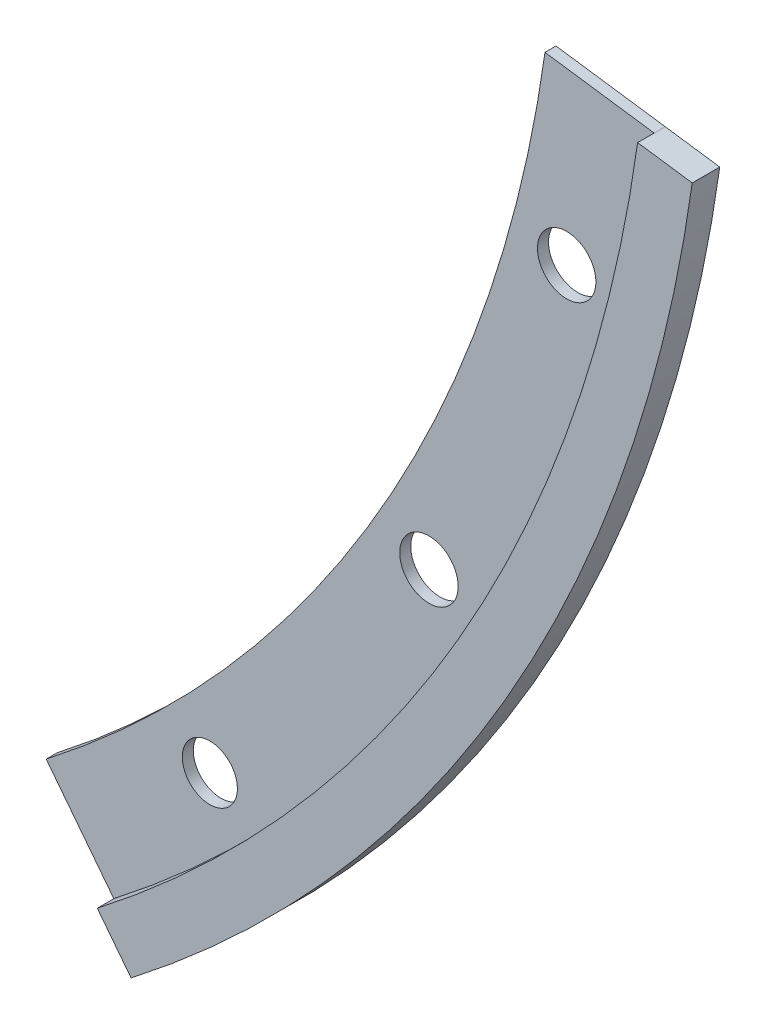
ISO-10303-21;
HEADER;
FILE_DESCRIPTION(('STEP AP214'),'2;1');
FILE_NAME('part.step','',(''),(''),'','','');
FILE_SCHEMA(('AUTOMOTIVE_DESIGN { 1 0 10303 214 1 1 1 1 }'));
ENDSEC;
DATA;
#1=APPLICATION_CONTEXT('core data for automotive mechanical design processes');
#2=APPLICATION_PROTOCOL_DEFINITION('international standard','automotive_design',2000,#1);
#3=PRODUCT_CONTEXT('',#1,'mechanical');
#4=PRODUCT('Part','Part','',(#3));
#5=PRODUCT_RELATED_PRODUCT_CATEGORY('part','',(#4));
#6=PRODUCT_DEFINITION_FORMATION('','',#4);
#7=PRODUCT_DEFINITION_CONTEXT('part definition',#1,'design');
#8=PRODUCT_DEFINITION('design','',#6,#7);
#9=PRODUCT_DEFINITION_SHAPE('','',#8);
#10=(LENGTH_UNIT() NAMED_UNIT(*) SI_UNIT(.MILLI.,.METRE.));
#11=(NAMED_UNIT(*) PLANE_ANGLE_UNIT() SI_UNIT($,.RADIAN.));
#12=(NAMED_UNIT(*) SI_UNIT($,.STERADIAN.) SOLID_ANGLE_UNIT());
#13=UNCERTAINTY_MEASURE_WITH_UNIT(LENGTH_MEASURE(1.E-05),#10,'distance_accuracy_value','');
#14=(GEOMETRIC_REPRESENTATION_CONTEXT(3) GLOBAL_UNCERTAINTY_ASSIGNED_CONTEXT((#13)) GLOBAL_UNIT_ASSIGNED_CONTEXT((#10,
#11,#12)) REPRESENTATION_CONTEXT('',''));
#15=CARTESIAN_POINT('',(0.,0.,0.));
#16=DIRECTION('',(0.,0.,1.));
#17=DIRECTION('',(1.,0.,0.));
#18=AXIS2_PLACEMENT_3D('',#15,#16,#17);
#19=CARTESIAN_POINT('',(0.,0.,5.));
#20=DIRECTION('',(0.,0.,-1.));
#21=DIRECTION('',(-1.,0.,0.));
#22=AXIS2_PLACEMENT_3D('',#19,#20,#21);
#23=CYLINDRICAL_SURFACE('',#22,270.);
#24=DIRECTION('',(0.,0.,-1.));
#25=VECTOR('',#24,1.);
#26=CARTESIAN_POINT('',(267.392003873156,-37.4368303238716,5.));
#27=LINE('',#26,#25);
#28=CARTESIAN_POINT('',(267.392003873156,-37.4368303238716,5.));
#29=VERTEX_POINT('',#28);
#30=CARTESIAN_POINT('',(267.392003873156,-37.4368303238716,0.));
#31=VERTEX_POINT('',#30);
#32=EDGE_CURVE('E101',#29,#31,#27,.T.);
#33=ORIENTED_EDGE('',*,*,#32,.F.);
#34=CARTESIAN_POINT('',(0.,0.,5.));
#35=DIRECTION('',(0.,0.,-1.));
#36=DIRECTION('',(-1.,0.,0.));
#37=AXIS2_PLACEMENT_3D('',#34,#35,#36);
#38=CIRCLE('',#37,270.);
#39=CARTESIAN_POINT('',(165.590214568056,-213.260124822493,5.));
#40=VERTEX_POINT('',#39);
#41=EDGE_CURVE('E93',#29,#40,#38,.T.);
#42=ORIENTED_EDGE('',*,*,#41,.T.);
#43=DIRECTION('',(0.,0.,-1.));
#44=VECTOR('',#43,1.);
#45=CARTESIAN_POINT('',(165.590214568056,-213.260124822493,5.));
#46=LINE('',#45,#44);
#47=CARTESIAN_POINT('',(165.590214568056,-213.260124822493,0.));
#48=VERTEX_POINT('',#47);
#49=EDGE_CURVE('E109',#48,#40,#46,.F.);
#50=ORIENTED_EDGE('',*,*,#49,.F.);
#51=CARTESIAN_POINT('',(0.,0.,0.));
#52=DIRECTION('',(0.,0.,-1.));
#53=DIRECTION('',(-1.,0.,0.));
#54=AXIS2_PLACEMENT_3D('',#51,#52,#53);
#55=CIRCLE('',#54,270.);
#56=EDGE_CURVE('E96',#31,#48,#55,.T.);
#57=ORIENTED_EDGE('',*,*,#56,.F.);
#58=EDGE_LOOP('',(#33,#42,#50,#57));
#59=FACE_BOUND('',#58,.T.);
#60=ADVANCED_FACE('F43',(#59),#23,.T.);
#61=CARTESIAN_POINT('',(0.,0.,5.));
#62=DIRECTION('',(0.,0.,-1.));
#63=DIRECTION('',(-1.,0.,0.));
#64=AXIS2_PLACEMENT_3D('',#61,#62,#63);
#65=PLANE('',#64);
#66=ORIENTED_EDGE('',*,*,#41,.F.);
#67=DIRECTION('',(0.990340755085761,-0.13865492712545,0.));
#68=VECTOR('',#67,1.);
#69=CARTESIAN_POINT('',(0.,0.,5.));
#70=LINE('',#69,#68);
#71=CARTESIAN_POINT('',(257.488596322298,-36.0502810526171,5.));
#72=VERTEX_POINT('',#71);
#73=EDGE_CURVE('E81',#72,#29,#70,.T.);
#74=ORIENTED_EDGE('',*,*,#73,.F.);
#75=CARTESIAN_POINT('',(0.,0.,5.));
#76=DIRECTION('',(0.,0.,-1.));
#77=DIRECTION('',(-1.,0.,0.));
#78=AXIS2_PLACEMENT_3D('',#75,#76,#77);
#79=CIRCLE('',#78,260.);
#80=CARTESIAN_POINT('',(159.457243658128,-205.361601680919,5.));
#81=VERTEX_POINT('',#80);
#82=EDGE_CURVE('E91',#72,#81,#79,.T.);
#83=ORIENTED_EDGE('',*,*,#82,.T.);
#84=DIRECTION('',(-0.613297090992799,0.789852314157381,0.));
#85=VECTOR('',#84,1.);
#86=CARTESIAN_POINT('',(0.,0.,5.));
#87=LINE('',#86,#85);
#88=EDGE_CURVE('E64',#40,#81,#87,.T.);
#89=ORIENTED_EDGE('',*,*,#88,.F.);
#90=EDGE_LOOP('',(#66,#74,#83,#89));
#91=FACE_BOUND('',#90,.T.);
#92=ADVANCED_FACE('F90',(#91),#65,.F.);
#93=CARTESIAN_POINT('',(0.,0.,0.));
#94=DIRECTION('',(0.,0.,-1.));
#95=DIRECTION('',(-1.,0.,0.));
#96=AXIS2_PLACEMENT_3D('',#93,#94,#95);
#97=PLANE('',#96);
#98=DIRECTION('',(0.990340755085761,-0.13865492712545,0.));
#99=VECTOR('',#98,1.);
#100=CARTESIAN_POINT('',(0.,0.,0.));
#101=LINE('',#100,#99);
#102=CARTESIAN_POINT('',(257.488596322298,-36.0502810526171,0.));
#103=VERTEX_POINT('',#102);
#104=EDGE_CURVE('E57',#103,#31,#101,.T.);
#105=ORIENTED_EDGE('',*,*,#104,.T.);
#106=ORIENTED_EDGE('',*,*,#56,.T.);
#107=DIRECTION('',(-0.613297090992799,0.789852314157381,0.));
#108=VECTOR('',#107,1.);
#109=CARTESIAN_POINT('',(0.,0.,0.));
#110=LINE('',#109,#108);
#111=CARTESIAN_POINT('',(159.457243658128,-205.361601680919,0.));
#112=VERTEX_POINT('',#111);
#113=EDGE_CURVE('E110',#48,#112,#110,.T.);
#114=ORIENTED_EDGE('',*,*,#113,.T.);
#115=CARTESIAN_POINT('',(0.,0.,0.));
#116=DIRECTION('',(0.,0.,-1.));
#117=DIRECTION('',(-1.,0.,0.));
#118=AXIS2_PLACEMENT_3D('',#115,#116,#117);
#119=CIRCLE('',#118,260.);
#120=EDGE_CURVE('E97',#103,#112,#119,.T.);
#121=ORIENTED_EDGE('',*,*,#120,.F.);
#122=EDGE_LOOP('',(#105,#106,#114,#121));
#123=FACE_BOUND('',#122,.T.);
#124=ADVANCED_FACE('F116',(#123),#97,.T.);
#125=CARTESIAN_POINT('',(0.,0.,5.));
#126=DIRECTION('',(0.,0.,-1.));
#127=DIRECTION('',(-1.,0.,0.));
#128=AXIS2_PLACEMENT_3D('',#125,#126,#127);
#129=CYLINDRICAL_SURFACE('',#128,260.);
#130=ORIENTED_EDGE('',*,*,#82,.F.);
#131=DIRECTION('',(0.,0.,-1.));
#132=VECTOR('',#131,1.);
#133=CARTESIAN_POINT('',(257.488596322298,-36.0502810526171,5.));
#134=LINE('',#133,#132);
#135=EDGE_CURVE('E12',#72,#103,#134,.T.);
#136=ORIENTED_EDGE('',*,*,#135,.T.);
#137=ORIENTED_EDGE('',*,*,#120,.T.);
#138=DIRECTION('',(0.,0.,-1.));
#139=VECTOR('',#138,1.);
#140=CARTESIAN_POINT('',(159.457243658128,-205.361601680919,5.));
#141=LINE('',#140,#139);
#142=EDGE_CURVE('E50',#112,#81,#141,.F.);
#143=ORIENTED_EDGE('',*,*,#142,.T.);
#144=EDGE_LOOP('',(#130,#136,#137,#143));
#145=FACE_BOUND('',#144,.T.);
#146=ADVANCED_FACE('F95',(#145),#129,.F.);
#147=CARTESIAN_POINT('',(0.,0.,0.));
#148=DIRECTION('',(0.789852314157381,0.613297090992799,0.));
#149=DIRECTION('',(-0.613297090992799,0.789852314157381,0.));
#150=AXIS2_PLACEMENT_3D('',#147,#148,#149);
#151=PLANE('',#150);
#152=ORIENTED_EDGE('',*,*,#49,.T.);
#153=ORIENTED_EDGE('',*,*,#88,.T.);
#154=ORIENTED_EDGE('',*,*,#142,.F.);
#155=ORIENTED_EDGE('',*,*,#113,.F.);
#156=EDGE_LOOP('',(#152,#153,#154,#155));
#157=FACE_BOUND('',#156,.T.);
#158=ADVANCED_FACE('F117',(#157),#151,.F.);
#159=CARTESIAN_POINT('',(0.,0.,0.));
#160=DIRECTION('',(-0.13865492712545,-0.990340755085761,0.));
#161=DIRECTION('',(0.990340755085761,-0.13865492712545,0.));
#162=AXIS2_PLACEMENT_3D('',#159,#160,#161);
#163=PLANE('',#162);
#164=ORIENTED_EDGE('',*,*,#32,.T.);
#165=ORIENTED_EDGE('',*,*,#104,.F.);
#166=ORIENTED_EDGE('',*,*,#135,.F.);
#167=ORIENTED_EDGE('',*,*,#73,.T.);
#168=EDGE_LOOP('',(#164,#165,#166,#167));
#169=FACE_BOUND('',#168,.T.);
#170=ADVANCED_FACE('F80',(#169),#163,.F.);
#171=CLOSED_SHELL('',(#60,#92,#124,#146,#158,#170));
#172=MANIFOLD_SOLID_BREP('B2',#171);
#173=CARTESIAN_POINT('',(0.,0.,2.));
#174=DIRECTION('',(0.,0.,1.));
#175=DIRECTION('',(1.,0.,0.));
#176=AXIS2_PLACEMENT_3D('',#173,#174,#175);
#177=PLANE('',#176);
#178=DIRECTION('',(0.990340755085761,-0.13865492712545,0.));
#179=VECTOR('',#178,1.);
#180=CARTESIAN_POINT('',(0.,0.,2.));
#181=LINE('',#180,#179);
#182=CARTESIAN_POINT('',(237.681781220583,-33.2771825101081,2.));
#183=VERTEX_POINT('',#182);
#184=CARTESIAN_POINT('',(257.488596322298,-36.0502810526171,2.));
#185=VERTEX_POINT('',#184);
#186=EDGE_CURVE('E208',#183,#185,#181,.T.);
#187=ORIENTED_EDGE('',*,*,#186,.F.);
#188=CARTESIAN_POINT('',(0.,0.,2.));
#189=DIRECTION('',(0.,0.,1.));
#190=DIRECTION('',(1.,0.,0.));
#191=AXIS2_PLACEMENT_3D('',#188,#189,#190);
#192=CIRCLE('',#191,240.);
#193=CARTESIAN_POINT('',(147.191301838272,-189.564555397771,2.));
#194=VERTEX_POINT('',#193);
#195=EDGE_CURVE('E229',#194,#183,#192,.T.);
#196=ORIENTED_EDGE('',*,*,#195,.F.);
#197=DIRECTION('',(-0.613297090992799,0.789852314157381,0.));
#198=VECTOR('',#197,1.);
#199=CARTESIAN_POINT('',(0.,0.,2.));
#200=LINE('',#199,#198);
#201=CARTESIAN_POINT('',(159.457243658128,-205.361601680919,2.));
#202=VERTEX_POINT('',#201);
#203=EDGE_CURVE('E189',#202,#194,#200,.T.);
#204=ORIENTED_EDGE('',*,*,#203,.F.);
#205=CARTESIAN_POINT('',(0.,0.,2.));
#206=DIRECTION('',(0.,0.,1.));
#207=DIRECTION('',(1.,0.,0.));
#208=AXIS2_PLACEMENT_3D('',#205,#206,#207);
#209=CIRCLE('',#208,260.);
#210=EDGE_CURVE('E228',#202,#185,#209,.T.);
#211=ORIENTED_EDGE('',*,*,#210,.T.);
#212=EDGE_LOOP('',(#187,#196,#204,#211));
#213=FACE_BOUND('',#212,.T.);
#214=CARTESIAN_POINT('',(216.627579108069,-125.069991111933,2.));
#215=DIRECTION('',(0.,0.,1.));
#216=DIRECTION('',(1.,0.,0.));
#217=AXIS2_PLACEMENT_3D('',#214,#215,#216);
#218=CIRCLE('',#217,5.29999999999997);
#219=CARTESIAN_POINT('',(221.927579108069,-125.069991111933,2.));
#220=VERTEX_POINT('',#219);
#221=EDGE_CURVE('E246',#220,#220,#218,.T.);
#222=ORIENTED_EDGE('',*,*,#221,.F.);
#223=EDGE_LOOP('',(#222));
#224=FACE_BOUND('',#223,.T.);
#225=CARTESIAN_POINT('',(241.616669017534,-64.7409913411394,2.));
#226=DIRECTION('',(0.,0.,1.));
#227=DIRECTION('',(1.,0.,0.));
#228=AXIS2_PLACEMENT_3D('',#225,#226,#227);
#229=CIRCLE('',#228,5.3);
#230=CARTESIAN_POINT('',(246.916669017534,-64.7409913411394,2.));
#231=VERTEX_POINT('',#230);
#232=EDGE_CURVE('E240',#231,#231,#229,.T.);
#233=ORIENTED_EDGE('',*,*,#232,.F.);
#234=EDGE_LOOP('',(#233));
#235=FACE_BOUND('',#234,.T.);
#236=CARTESIAN_POINT('',(176.875677676391,-176.875677676382,2.));
#237=DIRECTION('',(0.,0.,1.));
#238=DIRECTION('',(1.,0.,0.));
#239=AXIS2_PLACEMENT_3D('',#236,#237,#238);
#240=CIRCLE('',#239,5.00000000000002);
#241=CARTESIAN_POINT('',(181.875677676391,-176.875677676382,2.));
#242=VERTEX_POINT('',#241);
#243=EDGE_CURVE('E251',#242,#242,#240,.T.);
#244=ORIENTED_EDGE('',*,*,#243,.F.);
#245=EDGE_LOOP('',(#244));
#246=FACE_BOUND('',#245,.T.);
#247=ADVANCED_FACE('F167',(#213,#224,#235,#246),#177,.T.);
#248=CARTESIAN_POINT('',(0.,0.,0.));
#249=DIRECTION('',(0.,0.,1.));
#250=DIRECTION('',(1.,0.,0.));
#251=AXIS2_PLACEMENT_3D('',#248,#249,#250);
#252=PLANE('',#251);
#253=CARTESIAN_POINT('',(0.,0.,0.));
#254=DIRECTION('',(0.,0.,1.));
#255=DIRECTION('',(1.,0.,0.));
#256=AXIS2_PLACEMENT_3D('',#253,#254,#255);
#257=CIRCLE('',#256,240.);
#258=CARTESIAN_POINT('',(147.191301838272,-189.564555397771,0.));
#259=VERTEX_POINT('',#258);
#260=CARTESIAN_POINT('',(237.681781220583,-33.2771825101081,0.));
#261=VERTEX_POINT('',#260);
#262=EDGE_CURVE('E223',#259,#261,#257,.T.);
#263=ORIENTED_EDGE('',*,*,#262,.T.);
#264=DIRECTION('',(0.990340755085761,-0.13865492712545,0.));
#265=VECTOR('',#264,1.);
#266=CARTESIAN_POINT('',(0.,0.,0.));
#267=LINE('',#266,#265);
#268=CARTESIAN_POINT('',(257.488596322298,-36.0502810526171,0.));
#269=VERTEX_POINT('',#268);
#270=EDGE_CURVE('E181',#261,#269,#267,.T.);
#271=ORIENTED_EDGE('',*,*,#270,.T.);
#272=CARTESIAN_POINT('',(0.,0.,0.));
#273=DIRECTION('',(0.,0.,1.));
#274=DIRECTION('',(1.,0.,0.));
#275=AXIS2_PLACEMENT_3D('',#272,#273,#274);
#276=CIRCLE('',#275,260.);
#277=CARTESIAN_POINT('',(159.457243658128,-205.361601680919,0.));
#278=VERTEX_POINT('',#277);
#279=EDGE_CURVE('E221',#278,#269,#276,.T.);
#280=ORIENTED_EDGE('',*,*,#279,.F.);
#281=DIRECTION('',(-0.613297090992799,0.789852314157381,0.));
#282=VECTOR('',#281,1.);
#283=CARTESIAN_POINT('',(0.,0.,0.));
#284=LINE('',#283,#282);
#285=EDGE_CURVE('E224',#278,#259,#284,.T.);
#286=ORIENTED_EDGE('',*,*,#285,.T.);
#287=EDGE_LOOP('',(#263,#271,#280,#286));
#288=FACE_BOUND('',#287,.T.);
#289=CARTESIAN_POINT('',(241.616669017534,-64.7409913411394,0.));
#290=DIRECTION('',(0.,0.,1.));
#291=DIRECTION('',(1.,0.,0.));
#292=AXIS2_PLACEMENT_3D('',#289,#290,#291);
#293=CIRCLE('',#292,5.3);
#294=CARTESIAN_POINT('',(246.916669017534,-64.7409913411394,0.));
#295=VERTEX_POINT('',#294);
#296=EDGE_CURVE('E242',#295,#295,#293,.T.);
#297=ORIENTED_EDGE('',*,*,#296,.T.);
#298=EDGE_LOOP('',(#297));
#299=FACE_BOUND('',#298,.T.);
#300=CARTESIAN_POINT('',(216.627579108069,-125.069991111933,0.));
#301=DIRECTION('',(0.,0.,1.));
#302=DIRECTION('',(1.,0.,0.));
#303=AXIS2_PLACEMENT_3D('',#300,#301,#302);
#304=CIRCLE('',#303,5.29999999999997);
#305=CARTESIAN_POINT('',(221.927579108069,-125.069991111933,0.));
#306=VERTEX_POINT('',#305);
#307=EDGE_CURVE('E248',#306,#306,#304,.T.);
#308=ORIENTED_EDGE('',*,*,#307,.T.);
#309=EDGE_LOOP('',(#308));
#310=FACE_BOUND('',#309,.T.);
#311=CARTESIAN_POINT('',(176.875677676391,-176.875677676382,0.));
#312=DIRECTION('',(0.,0.,1.));
#313=DIRECTION('',(1.,0.,0.));
#314=AXIS2_PLACEMENT_3D('',#311,#312,#313);
#315=CIRCLE('',#314,5.00000000000002);
#316=CARTESIAN_POINT('',(181.875677676391,-176.875677676382,0.));
#317=VERTEX_POINT('',#316);
#318=EDGE_CURVE('E213',#317,#317,#315,.T.);
#319=ORIENTED_EDGE('',*,*,#318,.T.);
#320=EDGE_LOOP('',(#319));
#321=FACE_BOUND('',#320,.T.);
#322=ADVANCED_FACE('F218',(#288,#299,#310,#321),#252,.F.);
#323=CARTESIAN_POINT('',(0.,0.,2.));
#324=DIRECTION('',(0.,0.,-1.));
#325=DIRECTION('',(-1.,0.,0.));
#326=AXIS2_PLACEMENT_3D('',#323,#324,#325);
#327=CYLINDRICAL_SURFACE('',#326,260.);
#328=ORIENTED_EDGE('',*,*,#279,.T.);
#329=DIRECTION('',(0.,0.,-1.));
#330=VECTOR('',#329,1.);
#331=CARTESIAN_POINT('',(257.488596322298,-36.0502810526171,2.));
#332=LINE('',#331,#330);
#333=EDGE_CURVE('E205',#269,#185,#332,.F.);
#334=ORIENTED_EDGE('',*,*,#333,.T.);
#335=ORIENTED_EDGE('',*,*,#210,.F.);
#336=DIRECTION('',(0.,0.,-1.));
#337=VECTOR('',#336,1.);
#338=CARTESIAN_POINT('',(159.457243658128,-205.361601680919,2.));
#339=LINE('',#338,#337);
#340=EDGE_CURVE('E227',#202,#278,#339,.T.);
#341=ORIENTED_EDGE('',*,*,#340,.T.);
#342=EDGE_LOOP('',(#328,#334,#335,#341));
#343=FACE_BOUND('',#342,.T.);
#344=ADVANCED_FACE('F169',(#343),#327,.T.);
#345=CARTESIAN_POINT('',(0.,0.,2.));
#346=DIRECTION('',(0.,0.,-1.));
#347=DIRECTION('',(-1.,0.,0.));
#348=AXIS2_PLACEMENT_3D('',#345,#346,#347);
#349=CYLINDRICAL_SURFACE('',#348,240.);
#350=DIRECTION('',(0.,0.,-1.));
#351=VECTOR('',#350,1.);
#352=CARTESIAN_POINT('',(237.681781220583,-33.2771825101081,2.));
#353=LINE('',#352,#351);
#354=EDGE_CURVE('E41',#261,#183,#353,.F.);
#355=ORIENTED_EDGE('',*,*,#354,.F.);
#356=ORIENTED_EDGE('',*,*,#262,.F.);
#357=DIRECTION('',(0.,0.,-1.));
#358=VECTOR('',#357,1.);
#359=CARTESIAN_POINT('',(147.191301838272,-189.564555397772,2.));
#360=LINE('',#359,#358);
#361=EDGE_CURVE('E175',#194,#259,#360,.T.);
#362=ORIENTED_EDGE('',*,*,#361,.F.);
#363=ORIENTED_EDGE('',*,*,#195,.T.);
#364=EDGE_LOOP('',(#355,#356,#362,#363));
#365=FACE_BOUND('',#364,.T.);
#366=ADVANCED_FACE('F239',(#365),#349,.F.);
#367=CARTESIAN_POINT('',(241.616669017534,-64.7409913411394,2.));
#368=DIRECTION('',(0.,0.,-1.));
#369=DIRECTION('',(-1.,0.,0.));
#370=AXIS2_PLACEMENT_3D('',#367,#368,#369);
#371=CYLINDRICAL_SURFACE('',#370,5.3);
#372=ORIENTED_EDGE('',*,*,#232,.T.);
#373=EDGE_LOOP('',(#372));
#374=FACE_BOUND('',#373,.T.);
#375=ORIENTED_EDGE('',*,*,#296,.F.);
#376=EDGE_LOOP('',(#375));
#377=FACE_BOUND('',#376,.T.);
#378=ADVANCED_FACE('F275',(#374,#377),#371,.F.);
#379=CARTESIAN_POINT('',(216.627579108069,-125.069991111933,2.));
#380=DIRECTION('',(0.,0.,-1.));
#381=DIRECTION('',(-1.,0.,0.));
#382=AXIS2_PLACEMENT_3D('',#379,#380,#381);
#383=CYLINDRICAL_SURFACE('',#382,5.29999999999997);
#384=ORIENTED_EDGE('',*,*,#221,.T.);
#385=EDGE_LOOP('',(#384));
#386=FACE_BOUND('',#385,.T.);
#387=ORIENTED_EDGE('',*,*,#307,.F.);
#388=EDGE_LOOP('',(#387));
#389=FACE_BOUND('',#388,.T.);
#390=ADVANCED_FACE('F278',(#386,#389),#383,.F.);
#391=CARTESIAN_POINT('',(176.875677676391,-176.875677676382,2.));
#392=DIRECTION('',(0.,0.,-1.));
#393=DIRECTION('',(-1.,0.,0.));
#394=AXIS2_PLACEMENT_3D('',#391,#392,#393);
#395=CYLINDRICAL_SURFACE('',#394,5.00000000000002);
#396=ORIENTED_EDGE('',*,*,#243,.T.);
#397=EDGE_LOOP('',(#396));
#398=FACE_BOUND('',#397,.T.);
#399=ORIENTED_EDGE('',*,*,#318,.F.);
#400=EDGE_LOOP('',(#399));
#401=FACE_BOUND('',#400,.T.);
#402=ADVANCED_FACE('F262',(#398,#401),#395,.F.);
#403=CARTESIAN_POINT('',(0.,0.,0.));
#404=DIRECTION('',(0.789852314157381,0.613297090992799,0.));
#405=DIRECTION('',(-0.613297090992799,0.789852314157381,0.));
#406=AXIS2_PLACEMENT_3D('',#403,#404,#405);
#407=PLANE('',#406);
#408=ORIENTED_EDGE('',*,*,#203,.T.);
#409=ORIENTED_EDGE('',*,*,#361,.T.);
#410=ORIENTED_EDGE('',*,*,#285,.F.);
#411=ORIENTED_EDGE('',*,*,#340,.F.);
#412=EDGE_LOOP('',(#408,#409,#410,#411));
#413=FACE_BOUND('',#412,.T.);
#414=ADVANCED_FACE('F235',(#413),#407,.F.);
#415=CARTESIAN_POINT('',(0.,0.,0.));
#416=DIRECTION('',(-0.13865492712545,-0.990340755085761,0.));
#417=DIRECTION('',(0.990340755085761,-0.13865492712545,0.));
#418=AXIS2_PLACEMENT_3D('',#415,#416,#417);
#419=PLANE('',#418);
#420=ORIENTED_EDGE('',*,*,#270,.F.);
#421=ORIENTED_EDGE('',*,*,#354,.T.);
#422=ORIENTED_EDGE('',*,*,#186,.T.);
#423=ORIENTED_EDGE('',*,*,#333,.F.);
#424=EDGE_LOOP('',(#420,#421,#422,#423));
#425=FACE_BOUND('',#424,.T.);
#426=ADVANCED_FACE('F206',(#425),#419,.F.);
#427=CLOSED_SHELL('',(#247,#322,#344,#366,#378,#390,#402,#414,#426));
#428=MANIFOLD_SOLID_BREP('B6',#427);
#429=ADVANCED_BREP_SHAPE_REPRESENTATION('',(#18,#172,#428),#14);
#430=SHAPE_DEFINITION_REPRESENTATION(#9,#429);
ENDSEC;
END-ISO-10303-21;
